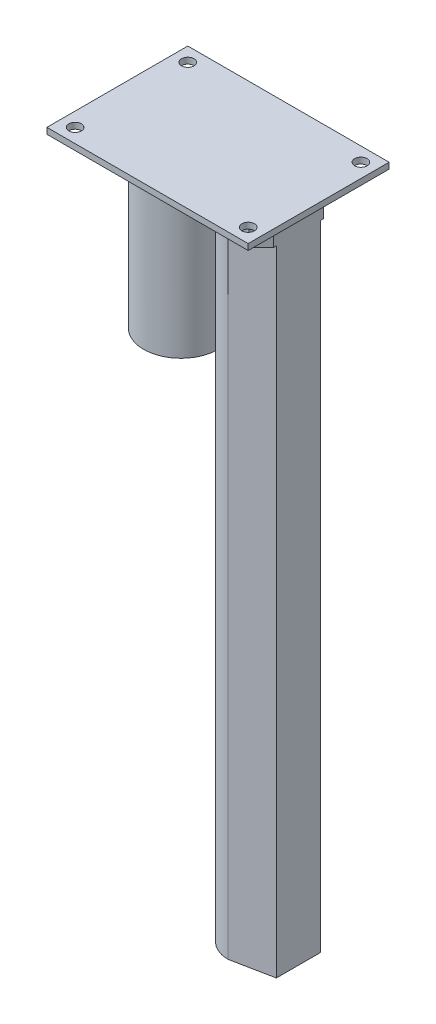
ISO-10303-21;
HEADER;
FILE_DESCRIPTION(('STEP AP214'),'2;1');
FILE_NAME('part.step','',(''),(''),'','','');
FILE_SCHEMA(('AUTOMOTIVE_DESIGN { 1 0 10303 214 1 1 1 1 }'));
ENDSEC;
DATA;
#1=APPLICATION_CONTEXT('core data for automotive mechanical design processes');
#2=APPLICATION_PROTOCOL_DEFINITION('international standard','automotive_design',2000,#1);
#3=PRODUCT_CONTEXT('',#1,'mechanical');
#4=PRODUCT('Part','Part','',(#3));
#5=PRODUCT_RELATED_PRODUCT_CATEGORY('part','',(#4));
#6=PRODUCT_DEFINITION_FORMATION('','',#4);
#7=PRODUCT_DEFINITION_CONTEXT('part definition',#1,'design');
#8=PRODUCT_DEFINITION('design','',#6,#7);
#9=PRODUCT_DEFINITION_SHAPE('','',#8);
#10=(LENGTH_UNIT() NAMED_UNIT(*) SI_UNIT(.MILLI.,.METRE.));
#11=(NAMED_UNIT(*) PLANE_ANGLE_UNIT() SI_UNIT($,.RADIAN.));
#12=(NAMED_UNIT(*) SI_UNIT($,.STERADIAN.) SOLID_ANGLE_UNIT());
#13=UNCERTAINTY_MEASURE_WITH_UNIT(LENGTH_MEASURE(1.E-05),#10,'distance_accuracy_value','');
#14=(GEOMETRIC_REPRESENTATION_CONTEXT(3) GLOBAL_UNCERTAINTY_ASSIGNED_CONTEXT((#13)) GLOBAL_UNIT_ASSIGNED_CONTEXT((#10,
#11,#12)) REPRESENTATION_CONTEXT('',''));
#15=CARTESIAN_POINT('',(0.,0.,0.));
#16=DIRECTION('',(0.,0.,1.));
#17=DIRECTION('',(1.,0.,0.));
#18=AXIS2_PLACEMENT_3D('',#15,#16,#17);
#19=CARTESIAN_POINT('',(-18.4,-15.,-15.5));
#20=DIRECTION('',(0.,0.,1.));
#21=DIRECTION('',(1.,0.,0.));
#22=AXIS2_PLACEMENT_3D('',#19,#20,#21);
#23=PLANE('',#22);
#24=DIRECTION('',(0.,1.,0.));
#25=VECTOR('',#24,1.);
#26=CARTESIAN_POINT('',(-18.4,-15.,-15.5));
#27=LINE('',#26,#25);
#28=CARTESIAN_POINT('',(-18.4,-12.,-15.5));
#29=VERTEX_POINT('',#28);
#30=CARTESIAN_POINT('',(-18.4,0.,-15.5));
#31=VERTEX_POINT('',#30);
#32=EDGE_CURVE('E41',#29,#31,#27,.T.);
#33=ORIENTED_EDGE('',*,*,#32,.F.);
#34=DIRECTION('',(1.,0.,0.));
#35=VECTOR('',#34,1.);
#36=CARTESIAN_POINT('',(-18.4,-12.,-15.5));
#37=LINE('',#36,#35);
#38=CARTESIAN_POINT('',(32.7573593128807,-12.,-15.5));
#39=VERTEX_POINT('',#38);
#40=EDGE_CURVE('E380',#29,#39,#37,.T.);
#41=ORIENTED_EDGE('',*,*,#40,.T.);
#42=DIRECTION('',(0.,1.,0.));
#43=VECTOR('',#42,1.);
#44=CARTESIAN_POINT('',(32.7573593128807,-15.,-15.5));
#45=LINE('',#44,#43);
#46=CARTESIAN_POINT('',(32.7573593128807,0.,-15.5));
#47=VERTEX_POINT('',#46);
#48=EDGE_CURVE('E118',#47,#39,#45,.F.);
#49=ORIENTED_EDGE('',*,*,#48,.F.);
#50=DIRECTION('',(1.,0.,0.));
#51=VECTOR('',#50,1.);
#52=CARTESIAN_POINT('',(0.,0.,-15.5));
#53=LINE('',#52,#51);
#54=EDGE_CURVE('E418',#31,#47,#53,.T.);
#55=ORIENTED_EDGE('',*,*,#54,.F.);
#56=EDGE_LOOP('',(#33,#41,#49,#55));
#57=FACE_BOUND('',#56,.T.);
#58=ADVANCED_FACE('F37',(#57),#23,.T.);
#59=CARTESIAN_POINT('',(37.8786796564404,-15.,-10.3786796564403));
#60=DIRECTION('',(-0.707106781186547,0.,0.707106781186548));
#61=DIRECTION('',(0.,1.,0.));
#62=AXIS2_PLACEMENT_3D('',#59,#60,#61);
#63=PLANE('',#62);
#64=DIRECTION('',(0.707106781186548,0.,0.707106781186547));
#65=VECTOR('',#64,1.);
#66=CARTESIAN_POINT('',(24.1286796564403,0.,-24.1286796564404));
#67=LINE('',#66,#65);
#68=CARTESIAN_POINT('',(37.,0.,-11.2573593128807));
#69=VERTEX_POINT('',#68);
#70=EDGE_CURVE('E374',#69,#47,#67,.F.);
#71=ORIENTED_EDGE('',*,*,#70,.T.);
#72=ORIENTED_EDGE('',*,*,#48,.T.);
#73=DIRECTION('',(-0.707106781186548,0.,-0.707106781186547));
#74=VECTOR('',#73,1.);
#75=CARTESIAN_POINT('',(14.9286796564403,-12.,-33.3286796564404));
#76=LINE('',#75,#74);
#77=CARTESIAN_POINT('',(37.,-12.,-11.2573593128807));
#78=VERTEX_POINT('',#77);
#79=EDGE_CURVE('E378',#39,#78,#76,.F.);
#80=ORIENTED_EDGE('',*,*,#79,.T.);
#81=DIRECTION('',(0.,-1.,0.));
#82=VECTOR('',#81,1.);
#83=CARTESIAN_POINT('',(37.,-15.,-11.2573593128807));
#84=LINE('',#83,#82);
#85=EDGE_CURVE('E415',#78,#69,#84,.F.);
#86=ORIENTED_EDGE('',*,*,#85,.T.);
#87=EDGE_LOOP('',(#71,#72,#80,#86));
#88=FACE_BOUND('',#87,.T.);
#89=ADVANCED_FACE('F436',(#88),#63,.T.);
#90=CARTESIAN_POINT('',(37.,-15.,18.5));
#91=DIRECTION('',(-1.,0.,0.));
#92=DIRECTION('',(0.,0.,1.));
#93=AXIS2_PLACEMENT_3D('',#90,#91,#92);
#94=PLANE('',#93);
#95=ORIENTED_EDGE('',*,*,#85,.F.);
#96=DIRECTION('',(0.,0.,1.));
#97=VECTOR('',#96,1.);
#98=CARTESIAN_POINT('',(37.,-12.,18.5));
#99=LINE('',#98,#97);
#100=CARTESIAN_POINT('',(37.,-12.,-8.54058829184433));
#101=VERTEX_POINT('',#100);
#102=EDGE_CURVE('E392',#78,#101,#99,.T.);
#103=ORIENTED_EDGE('',*,*,#102,.T.);
#104=DIRECTION('',(0.,1.,0.));
#105=VECTOR('',#104,1.);
#106=CARTESIAN_POINT('',(37.,-15.,-8.54058829184433));
#107=LINE('',#106,#105);
#108=CARTESIAN_POINT('',(37.,-327.,-8.54058829184433));
#109=VERTEX_POINT('',#108);
#110=EDGE_CURVE('E408',#109,#101,#107,.T.);
#111=ORIENTED_EDGE('',*,*,#110,.F.);
#112=DIRECTION('',(0.,0.,1.));
#113=VECTOR('',#112,1.);
#114=CARTESIAN_POINT('',(37.,-327.,18.5));
#115=LINE('',#114,#113);
#116=CARTESIAN_POINT('',(37.,-327.,8.54058829184432));
#117=VERTEX_POINT('',#116);
#118=EDGE_CURVE('E11',#109,#117,#115,.T.);
#119=ORIENTED_EDGE('',*,*,#118,.T.);
#120=DIRECTION('',(0.,1.,0.));
#121=VECTOR('',#120,1.);
#122=CARTESIAN_POINT('',(37.,-15.,8.54058829184433));
#123=LINE('',#122,#121);
#124=CARTESIAN_POINT('',(37.,-12.,8.54058829184432));
#125=VERTEX_POINT('',#124);
#126=EDGE_CURVE('E354',#117,#125,#123,.T.);
#127=ORIENTED_EDGE('',*,*,#126,.T.);
#128=DIRECTION('',(0.,0.,1.));
#129=VECTOR('',#128,1.);
#130=CARTESIAN_POINT('',(37.,-12.,18.5));
#131=LINE('',#130,#129);
#132=CARTESIAN_POINT('',(37.,-12.,11.2573593128807));
#133=VERTEX_POINT('',#132);
#134=EDGE_CURVE('E386',#125,#133,#131,.T.);
#135=ORIENTED_EDGE('',*,*,#134,.T.);
#136=DIRECTION('',(0.,1.,0.));
#137=VECTOR('',#136,1.);
#138=CARTESIAN_POINT('',(37.,-15.,11.2573593128807));
#139=LINE('',#138,#137);
#140=CARTESIAN_POINT('',(37.,0.,11.2573593128807));
#141=VERTEX_POINT('',#140);
#142=EDGE_CURVE('E113',#141,#133,#139,.F.);
#143=ORIENTED_EDGE('',*,*,#142,.F.);
#144=DIRECTION('',(0.,0.,1.));
#145=VECTOR('',#144,1.);
#146=CARTESIAN_POINT('',(37.,0.,0.));
#147=LINE('',#146,#145);
#148=EDGE_CURVE('E412',#69,#141,#147,.T.);
#149=ORIENTED_EDGE('',*,*,#148,.F.);
#150=EDGE_LOOP('',(#95,#103,#111,#119,#127,#135,#143,#149));
#151=FACE_BOUND('',#150,.T.);
#152=ADVANCED_FACE('F437',(#151),#94,.T.);
#153=CARTESIAN_POINT('',(31.8786796564403,-15.,16.3786796564404));
#154=DIRECTION('',(-0.707106781186549,0.,-0.707106781186546));
#155=DIRECTION('',(0.,1.,0.));
#156=AXIS2_PLACEMENT_3D('',#153,#154,#155);
#157=PLANE('',#156);
#158=DIRECTION('',(-0.707106781186546,0.,0.707106781186549));
#159=VECTOR('',#158,1.);
#160=CARTESIAN_POINT('',(24.1286796564404,0.,24.1286796564403));
#161=LINE('',#160,#159);
#162=CARTESIAN_POINT('',(32.7573593128807,0.,15.5));
#163=VERTEX_POINT('',#162);
#164=EDGE_CURVE('E376',#163,#141,#161,.F.);
#165=ORIENTED_EDGE('',*,*,#164,.T.);
#166=ORIENTED_EDGE('',*,*,#142,.T.);
#167=DIRECTION('',(0.707106781186546,0.,-0.707106781186549));
#168=VECTOR('',#167,1.);
#169=CARTESIAN_POINT('',(14.9286796564405,-12.,33.3286796564403));
#170=LINE('',#169,#168);
#171=CARTESIAN_POINT('',(32.7573593128807,-12.,15.5));
#172=VERTEX_POINT('',#171);
#173=EDGE_CURVE('E384',#133,#172,#170,.F.);
#174=ORIENTED_EDGE('',*,*,#173,.T.);
#175=DIRECTION('',(0.,-1.,0.));
#176=VECTOR('',#175,1.);
#177=CARTESIAN_POINT('',(32.7573593128807,-15.,15.5));
#178=LINE('',#177,#176);
#179=EDGE_CURVE('E405',#172,#163,#178,.F.);
#180=ORIENTED_EDGE('',*,*,#179,.T.);
#181=EDGE_LOOP('',(#165,#166,#174,#180));
#182=FACE_BOUND('',#181,.T.);
#183=ADVANCED_FACE('F463',(#182),#157,.T.);
#184=CARTESIAN_POINT('',(-18.4,-15.,15.5));
#185=DIRECTION('',(0.,0.,-1.));
#186=DIRECTION('',(-1.,0.,0.));
#187=AXIS2_PLACEMENT_3D('',#184,#185,#186);
#188=PLANE('',#187);
#189=ORIENTED_EDGE('',*,*,#179,.F.);
#190=DIRECTION('',(-1.,0.,0.));
#191=VECTOR('',#190,1.);
#192=CARTESIAN_POINT('',(-18.4,-12.,15.5));
#193=LINE('',#192,#191);
#194=CARTESIAN_POINT('',(-18.4,-12.,15.5));
#195=VERTEX_POINT('',#194);
#196=EDGE_CURVE('E382',#172,#195,#193,.T.);
#197=ORIENTED_EDGE('',*,*,#196,.T.);
#198=DIRECTION('',(0.,1.,0.));
#199=VECTOR('',#198,1.);
#200=CARTESIAN_POINT('',(-18.4,-15.,15.5));
#201=LINE('',#200,#199);
#202=CARTESIAN_POINT('',(-18.4,0.,15.5));
#203=VERTEX_POINT('',#202);
#204=EDGE_CURVE('E400',#195,#203,#201,.T.);
#205=ORIENTED_EDGE('',*,*,#204,.T.);
#206=DIRECTION('',(-1.,0.,0.));
#207=VECTOR('',#206,1.);
#208=CARTESIAN_POINT('',(0.,0.,15.5));
#209=LINE('',#208,#207);
#210=EDGE_CURVE('E403',#163,#203,#209,.T.);
#211=ORIENTED_EDGE('',*,*,#210,.F.);
#212=EDGE_LOOP('',(#189,#197,#205,#211));
#213=FACE_BOUND('',#212,.T.);
#214=ADVANCED_FACE('F466',(#213),#188,.T.);
#215=CARTESIAN_POINT('',(-18.4,-15.,0.));
#216=DIRECTION('',(0.,1.,0.));
#217=DIRECTION('',(0.,0.,1.));
#218=AXIS2_PLACEMENT_3D('',#215,#216,#217);
#219=CYLINDRICAL_SURFACE('',#218,15.5);
#220=CARTESIAN_POINT('',(-18.4,-82.,0.));
#221=DIRECTION('',(0.,-1.,0.));
#222=DIRECTION('',(0.,0.,-1.));
#223=AXIS2_PLACEMENT_3D('',#220,#221,#222);
#224=CIRCLE('',#223,15.5);
#225=CARTESIAN_POINT('',(-18.4,-82.,-15.5));
#226=VERTEX_POINT('',#225);
#227=EDGE_CURVE('E371',#226,#226,#224,.T.);
#228=ORIENTED_EDGE('',*,*,#227,.T.);
#229=EDGE_LOOP('',(#228));
#230=FACE_BOUND('',#229,.T.);
#231=ORIENTED_EDGE('',*,*,#204,.F.);
#232=CARTESIAN_POINT('',(-18.4,-12.,0.));
#233=DIRECTION('',(0.,-1.,0.));
#234=DIRECTION('',(0.,0.,-1.));
#235=AXIS2_PLACEMENT_3D('',#232,#233,#234);
#236=CIRCLE('',#235,15.5);
#237=EDGE_CURVE('E394',#29,#195,#236,.T.);
#238=ORIENTED_EDGE('',*,*,#237,.F.);
#239=ORIENTED_EDGE('',*,*,#32,.T.);
#240=CARTESIAN_POINT('',(-18.4,0.,0.));
#241=DIRECTION('',(0.,1.,0.));
#242=DIRECTION('',(0.,0.,1.));
#243=AXIS2_PLACEMENT_3D('',#240,#241,#242);
#244=CIRCLE('',#243,15.5);
#245=EDGE_CURVE('E397',#203,#31,#244,.F.);
#246=ORIENTED_EDGE('',*,*,#245,.F.);
#247=EDGE_LOOP('',(#231,#238,#239,#246));
#248=FACE_BOUND('',#247,.T.);
#249=ADVANCED_FACE('F427',(#230,#248),#219,.F.);
#250=CARTESIAN_POINT('',(-18.4,-12.,0.));
#251=DIRECTION('',(0.,-1.,0.));
#252=DIRECTION('',(0.,0.,-1.));
#253=AXIS2_PLACEMENT_3D('',#250,#251,#252);
#254=PLANE('',#253);
#255=ORIENTED_EDGE('',*,*,#102,.F.);
#256=ORIENTED_EDGE('',*,*,#79,.F.);
#257=ORIENTED_EDGE('',*,*,#40,.F.);
#258=ORIENTED_EDGE('',*,*,#237,.T.);
#259=ORIENTED_EDGE('',*,*,#196,.F.);
#260=ORIENTED_EDGE('',*,*,#173,.F.);
#261=ORIENTED_EDGE('',*,*,#134,.F.);
#262=DIRECTION('',(0.98058067569092,0.,-0.196116135138184));
#263=VECTOR('',#262,1.);
#264=CARTESIAN_POINT('',(3.06549774843161,-12.,15.327488742158));
#265=LINE('',#264,#263);
#266=CARTESIAN_POINT('',(19.7193526485845,-12.,11.9967177621274));
#267=VERTEX_POINT('',#266);
#268=EDGE_CURVE('E388',#267,#125,#265,.T.);
#269=ORIENTED_EDGE('',*,*,#268,.F.);
#270=CARTESIAN_POINT('',(20.,-12.,0.));
#271=DIRECTION('',(0.,-1.,0.));
#272=DIRECTION('',(0.,0.,-1.));
#273=AXIS2_PLACEMENT_3D('',#270,#271,#272);
#274=CIRCLE('',#273,12.);
#275=CARTESIAN_POINT('',(19.7193526485846,-12.,-11.9967177621274));
#276=VERTEX_POINT('',#275);
#277=EDGE_CURVE('E390',#276,#267,#274,.F.);
#278=ORIENTED_EDGE('',*,*,#277,.F.);
#279=DIRECTION('',(0.98058067569092,0.,0.196116135138184));
#280=VECTOR('',#279,1.);
#281=CARTESIAN_POINT('',(3.06549774843161,-12.,-15.327488742158));
#282=LINE('',#281,#280);
#283=EDGE_CURVE('E362',#276,#101,#282,.T.);
#284=ORIENTED_EDGE('',*,*,#283,.T.);
#285=EDGE_LOOP('',(#255,#256,#257,#258,#259,#260,#261,#269,#278,#284));
#286=FACE_BOUND('',#285,.T.);
#287=ADVANCED_FACE('F433',(#286),#254,.F.);
#288=CARTESIAN_POINT('',(0.,0.,0.));
#289=DIRECTION('',(0.,1.,0.));
#290=DIRECTION('',(0.,0.,1.));
#291=AXIS2_PLACEMENT_3D('',#288,#289,#290);
#292=PLANE('',#291);
#293=ORIENTED_EDGE('',*,*,#54,.T.);
#294=ORIENTED_EDGE('',*,*,#70,.F.);
#295=ORIENTED_EDGE('',*,*,#148,.T.);
#296=ORIENTED_EDGE('',*,*,#164,.F.);
#297=ORIENTED_EDGE('',*,*,#210,.T.);
#298=ORIENTED_EDGE('',*,*,#245,.T.);
#299=EDGE_LOOP('',(#293,#294,#295,#296,#297,#298));
#300=FACE_BOUND('',#299,.T.);
#301=ADVANCED_FACE('F439',(#300),#292,.F.);
#302=CARTESIAN_POINT('',(-18.4,-82.,0.));
#303=DIRECTION('',(0.,-1.,0.));
#304=DIRECTION('',(0.,0.,-1.));
#305=AXIS2_PLACEMENT_3D('',#302,#303,#304);
#306=PLANE('',#305);
#307=ORIENTED_EDGE('',*,*,#227,.F.);
#308=EDGE_LOOP('',(#307));
#309=FACE_BOUND('',#308,.T.);
#310=ADVANCED_FACE('F441',(#309),#306,.F.);
#311=CARTESIAN_POINT('',(20.,-330.,0.));
#312=DIRECTION('',(0.,1.,0.));
#313=DIRECTION('',(0.,0.,1.));
#314=AXIS2_PLACEMENT_3D('',#311,#312,#313);
#315=CYLINDRICAL_SURFACE('',#314,12.);
#316=ORIENTED_EDGE('',*,*,#277,.T.);
#317=DIRECTION('',(0.,1.,0.));
#318=VECTOR('',#317,1.);
#319=CARTESIAN_POINT('',(19.7193526485845,-327.,11.9967177621274));
#320=LINE('',#319,#318);
#321=CARTESIAN_POINT('',(19.7193526485845,-327.,11.9967177621274));
#322=VERTEX_POINT('',#321);
#323=EDGE_CURVE('E365',#322,#267,#320,.T.);
#324=ORIENTED_EDGE('',*,*,#323,.F.);
#325=CARTESIAN_POINT('',(20.,-327.,0.));
#326=DIRECTION('',(0.,-1.,0.));
#327=DIRECTION('',(0.,0.,-1.));
#328=AXIS2_PLACEMENT_3D('',#325,#326,#327);
#329=CIRCLE('',#328,12.);
#330=CARTESIAN_POINT('',(19.7193526485846,-327.,-11.9967177621274));
#331=VERTEX_POINT('',#330);
#332=EDGE_CURVE('E368',#331,#322,#329,.F.);
#333=ORIENTED_EDGE('',*,*,#332,.F.);
#334=DIRECTION('',(0.,1.,0.));
#335=VECTOR('',#334,1.);
#336=CARTESIAN_POINT('',(19.7193526485846,-327.,-11.9967177621274));
#337=LINE('',#336,#335);
#338=EDGE_CURVE('E359',#331,#276,#337,.T.);
#339=ORIENTED_EDGE('',*,*,#338,.T.);
#340=EDGE_LOOP('',(#316,#324,#333,#339));
#341=FACE_BOUND('',#340,.T.);
#342=ADVANCED_FACE('F447',(#341),#315,.F.);
#343=CARTESIAN_POINT('',(3.06549774843161,-330.,-15.327488742158));
#344=DIRECTION('',(-0.196116135138184,0.,0.98058067569092));
#345=DIRECTION('',(0.98058067569092,0.,0.196116135138184));
#346=AXIS2_PLACEMENT_3D('',#343,#344,#345);
#347=PLANE('',#346);
#348=ORIENTED_EDGE('',*,*,#283,.F.);
#349=ORIENTED_EDGE('',*,*,#338,.F.);
#350=DIRECTION('',(0.98058067569092,0.,0.196116135138184));
#351=VECTOR('',#350,1.);
#352=CARTESIAN_POINT('',(3.06549774843161,-327.,-15.327488742158));
#353=LINE('',#352,#351);
#354=EDGE_CURVE('E47',#331,#109,#353,.T.);
#355=ORIENTED_EDGE('',*,*,#354,.T.);
#356=ORIENTED_EDGE('',*,*,#110,.T.);
#357=EDGE_LOOP('',(#348,#349,#355,#356));
#358=FACE_BOUND('',#357,.T.);
#359=ADVANCED_FACE('F503',(#358),#347,.T.);
#360=CARTESIAN_POINT('',(3.06549774843161,-330.,15.327488742158));
#361=DIRECTION('',(0.196116135138184,0.,0.98058067569092));
#362=DIRECTION('',(0.98058067569092,0.,-0.196116135138184));
#363=AXIS2_PLACEMENT_3D('',#360,#361,#362);
#364=PLANE('',#363);
#365=ORIENTED_EDGE('',*,*,#268,.T.);
#366=ORIENTED_EDGE('',*,*,#126,.F.);
#367=DIRECTION('',(0.98058067569092,0.,-0.196116135138184));
#368=VECTOR('',#367,1.);
#369=CARTESIAN_POINT('',(3.06549774843161,-327.,15.327488742158));
#370=LINE('',#369,#368);
#371=EDGE_CURVE('E356',#322,#117,#370,.T.);
#372=ORIENTED_EDGE('',*,*,#371,.F.);
#373=ORIENTED_EDGE('',*,*,#323,.T.);
#374=EDGE_LOOP('',(#365,#366,#372,#373));
#375=FACE_BOUND('',#374,.T.);
#376=ADVANCED_FACE('F513',(#375),#364,.F.);
#377=CARTESIAN_POINT('',(0.,-327.,0.));
#378=DIRECTION('',(0.,-1.,0.));
#379=DIRECTION('',(0.,0.,-1.));
#380=AXIS2_PLACEMENT_3D('',#377,#378,#379);
#381=PLANE('',#380);
#382=CARTESIAN_POINT('',(20.,-327.,0.));
#383=DIRECTION('',(0.,-1.,0.));
#384=DIRECTION('',(0.,0.,-1.));
#385=AXIS2_PLACEMENT_3D('',#382,#383,#384);
#386=CIRCLE('',#385,9.99999999999999);
#387=CARTESIAN_POINT('',(20.,-327.,-9.99999999999999));
#388=VERTEX_POINT('',#387);
#389=EDGE_CURVE('E237',#388,#388,#386,.F.);
#390=ORIENTED_EDGE('',*,*,#389,.F.);
#391=EDGE_LOOP('',(#390));
#392=FACE_BOUND('',#391,.T.);
#393=ORIENTED_EDGE('',*,*,#332,.T.);
#394=ORIENTED_EDGE('',*,*,#371,.T.);
#395=ORIENTED_EDGE('',*,*,#118,.F.);
#396=ORIENTED_EDGE('',*,*,#354,.F.);
#397=EDGE_LOOP('',(#393,#394,#395,#396));
#398=FACE_BOUND('',#397,.T.);
#399=ADVANCED_FACE('F39',(#392,#398),#381,.F.);
#400=CARTESIAN_POINT('',(20.,3.00099999999998,0.));
#401=DIRECTION('',(0.,-1.,0.));
#402=DIRECTION('',(0.,0.,-1.));
#403=AXIS2_PLACEMENT_3D('',#400,#401,#402);
#404=CYLINDRICAL_SURFACE('',#403,9.99999999999999);
#405=CARTESIAN_POINT('',(20.,-330.,0.));
#406=DIRECTION('',(0.,-1.,0.));
#407=DIRECTION('',(0.,0.,-1.));
#408=AXIS2_PLACEMENT_3D('',#405,#406,#407);
#409=CIRCLE('',#408,9.99999999999999);
#410=CARTESIAN_POINT('',(20.,-330.,-9.99999999999999));
#411=VERTEX_POINT('',#410);
#412=EDGE_CURVE('E852',#411,#411,#409,.T.);
#413=ORIENTED_EDGE('',*,*,#412,.T.);
#414=EDGE_LOOP('',(#413));
#415=FACE_BOUND('',#414,.T.);
#416=ORIENTED_EDGE('',*,*,#389,.T.);
#417=EDGE_LOOP('',(#416));
#418=FACE_BOUND('',#417,.T.);
#419=ADVANCED_FACE('F532',(#415,#418),#404,.F.);
#420=CARTESIAN_POINT('',(-18.4,-15.,0.));
#421=DIRECTION('',(0.,-1.,0.));
#422=DIRECTION('',(0.,0.,-1.));
#423=AXIS2_PLACEMENT_3D('',#420,#421,#422);
#424=PLANE('',#423);
#425=DIRECTION('',(0.,0.,1.));
#426=VECTOR('',#425,1.);
#427=CARTESIAN_POINT('',(40.,-15.,18.5));
#428=LINE('',#427,#426);
#429=CARTESIAN_POINT('',(40.,-15.,-12.5));
#430=VERTEX_POINT('',#429);
#431=CARTESIAN_POINT('',(40.,-15.,-11.));
#432=VERTEX_POINT('',#431);
#433=EDGE_CURVE('E261',#430,#432,#428,.T.);
#434=ORIENTED_EDGE('',*,*,#433,.T.);
#435=DIRECTION('',(0.98058067569092,0.,0.196116135138184));
#436=VECTOR('',#435,1.);
#437=CARTESIAN_POINT('',(3.65384615384616,-15.,-18.2692307692308));
#438=LINE('',#437,#436);
#439=CARTESIAN_POINT('',(20.,-15.,-15.));
#440=VERTEX_POINT('',#439);
#441=EDGE_CURVE('E126',#440,#432,#438,.T.);
#442=ORIENTED_EDGE('',*,*,#441,.F.);
#443=CARTESIAN_POINT('',(20.,-15.,0.));
#444=DIRECTION('',(0.,-1.,0.));
#445=DIRECTION('',(0.,0.,-1.));
#446=AXIS2_PLACEMENT_3D('',#443,#444,#445);
#447=CIRCLE('',#446,15.);
#448=CARTESIAN_POINT('',(20.,-15.,15.));
#449=VERTEX_POINT('',#448);
#450=EDGE_CURVE('E218',#440,#449,#447,.F.);
#451=ORIENTED_EDGE('',*,*,#450,.T.);
#452=DIRECTION('',(0.98058067569092,0.,-0.196116135138184));
#453=VECTOR('',#452,1.);
#454=CARTESIAN_POINT('',(3.65384615384616,-15.,18.2692307692308));
#455=LINE('',#454,#453);
#456=CARTESIAN_POINT('',(40.,-15.,11.));
#457=VERTEX_POINT('',#456);
#458=EDGE_CURVE('E132',#449,#457,#455,.T.);
#459=ORIENTED_EDGE('',*,*,#458,.T.);
#460=CARTESIAN_POINT('',(40.,-15.,12.5));
#461=VERTEX_POINT('',#460);
#462=EDGE_CURVE('E259',#457,#461,#428,.T.);
#463=ORIENTED_EDGE('',*,*,#462,.T.);
#464=DIRECTION('',(0.707106781186546,0.,-0.707106781186549));
#465=VECTOR('',#464,1.);
#466=CARTESIAN_POINT('',(17.0500000000001,-15.,35.4499999999999));
#467=LINE('',#466,#465);
#468=CARTESIAN_POINT('',(34.,-15.,18.5));
#469=VERTEX_POINT('',#468);
#470=EDGE_CURVE('E345',#461,#469,#467,.F.);
#471=ORIENTED_EDGE('',*,*,#470,.T.);
#472=DIRECTION('',(-1.,0.,0.));
#473=VECTOR('',#472,1.);
#474=CARTESIAN_POINT('',(-18.4,-15.,18.5));
#475=LINE('',#474,#473);
#476=CARTESIAN_POINT('',(-18.4,-15.,18.5));
#477=VERTEX_POINT('',#476);
#478=EDGE_CURVE('E263',#469,#477,#475,.T.);
#479=ORIENTED_EDGE('',*,*,#478,.T.);
#480=CARTESIAN_POINT('',(-18.4,-15.,0.));
#481=DIRECTION('',(0.,-1.,0.));
#482=DIRECTION('',(0.,0.,-1.));
#483=AXIS2_PLACEMENT_3D('',#480,#481,#482);
#484=CIRCLE('',#483,18.5);
#485=CARTESIAN_POINT('',(-18.4,-15.,-18.5));
#486=VERTEX_POINT('',#485);
#487=EDGE_CURVE('E220',#486,#477,#484,.T.);
#488=ORIENTED_EDGE('',*,*,#487,.F.);
#489=DIRECTION('',(1.,0.,0.));
#490=VECTOR('',#489,1.);
#491=CARTESIAN_POINT('',(-18.4,-15.,-18.5));
#492=LINE('',#491,#490);
#493=CARTESIAN_POINT('',(34.,-15.,-18.5));
#494=VERTEX_POINT('',#493);
#495=EDGE_CURVE('E256',#486,#494,#492,.T.);
#496=ORIENTED_EDGE('',*,*,#495,.T.);
#497=DIRECTION('',(-0.707106781186548,0.,-0.707106781186547));
#498=VECTOR('',#497,1.);
#499=CARTESIAN_POINT('',(17.0499999999999,-15.,-35.45));
#500=LINE('',#499,#498);
#501=EDGE_CURVE('E343',#494,#430,#500,.F.);
#502=ORIENTED_EDGE('',*,*,#501,.T.);
#503=EDGE_LOOP('',(#434,#442,#451,#459,#463,#471,#479,#488,#496,#502));
#504=FACE_BOUND('',#503,.T.);
#505=ADVANCED_FACE('F541',(#504),#424,.T.);
#506=CARTESIAN_POINT('',(0.,0.,0.));
#507=DIRECTION('',(0.,1.,0.));
#508=DIRECTION('',(0.,0.,1.));
#509=AXIS2_PLACEMENT_3D('',#506,#507,#508);
#510=PLANE('',#509);
#511=CARTESIAN_POINT('',(43.,0.,28.));
#512=DIRECTION('',(0.,1.,0.));
#513=DIRECTION('',(0.,0.,1.));
#514=AXIS2_PLACEMENT_3D('',#511,#512,#513);
#515=CIRCLE('',#514,3.09999999999999);
#516=CARTESIAN_POINT('',(43.,0.,31.1));
#517=VERTEX_POINT('',#516);
#518=EDGE_CURVE('E328',#517,#517,#515,.T.);
#519=ORIENTED_EDGE('',*,*,#518,.T.);
#520=EDGE_LOOP('',(#519));
#521=FACE_BOUND('',#520,.T.);
#522=CARTESIAN_POINT('',(43.,0.,-28.));
#523=DIRECTION('',(0.,1.,0.));
#524=DIRECTION('',(0.,0.,1.));
#525=AXIS2_PLACEMENT_3D('',#522,#523,#524);
#526=CIRCLE('',#525,3.09999999999999);
#527=CARTESIAN_POINT('',(43.,0.,-24.9));
#528=VERTEX_POINT('',#527);
#529=EDGE_CURVE('E322',#528,#528,#526,.T.);
#530=ORIENTED_EDGE('',*,*,#529,.T.);
#531=EDGE_LOOP('',(#530));
#532=FACE_BOUND('',#531,.T.);
#533=DIRECTION('',(0.,0.,-1.));
#534=VECTOR('',#533,1.);
#535=CARTESIAN_POINT('',(50.,0.,-35.));
#536=LINE('',#535,#534);
#537=CARTESIAN_POINT('',(50.,0.,35.));
#538=VERTEX_POINT('',#537);
#539=CARTESIAN_POINT('',(50.,0.,-35.));
#540=VERTEX_POINT('',#539);
#541=EDGE_CURVE('E290',#538,#540,#536,.T.);
#542=ORIENTED_EDGE('',*,*,#541,.F.);
#543=DIRECTION('',(1.,0.,0.));
#544=VECTOR('',#543,1.);
#545=CARTESIAN_POINT('',(-50.,0.,35.));
#546=LINE('',#545,#544);
#547=CARTESIAN_POINT('',(-50.,0.,35.));
#548=VERTEX_POINT('',#547);
#549=EDGE_CURVE('E297',#548,#538,#546,.T.);
#550=ORIENTED_EDGE('',*,*,#549,.F.);
#551=DIRECTION('',(0.,0.,1.));
#552=VECTOR('',#551,1.);
#553=CARTESIAN_POINT('',(-50.,0.,-35.));
#554=LINE('',#553,#552);
#555=CARTESIAN_POINT('',(-50.,0.,-35.));
#556=VERTEX_POINT('',#555);
#557=EDGE_CURVE('E308',#556,#548,#554,.T.);
#558=ORIENTED_EDGE('',*,*,#557,.F.);
#559=DIRECTION('',(-1.,0.,0.));
#560=VECTOR('',#559,1.);
#561=CARTESIAN_POINT('',(-50.,0.,-35.));
#562=LINE('',#561,#560);
#563=EDGE_CURVE('E306',#540,#556,#562,.T.);
#564=ORIENTED_EDGE('',*,*,#563,.F.);
#565=EDGE_LOOP('',(#542,#550,#558,#564));
#566=FACE_BOUND('',#565,.T.);
#567=CARTESIAN_POINT('',(-43.,0.,-28.));
#568=DIRECTION('',(0.,1.,0.));
#569=DIRECTION('',(0.,0.,1.));
#570=AXIS2_PLACEMENT_3D('',#567,#568,#569);
#571=CIRCLE('',#570,3.09999999999999);
#572=CARTESIAN_POINT('',(-43.,0.,-24.9));
#573=VERTEX_POINT('',#572);
#574=EDGE_CURVE('E287',#573,#573,#571,.T.);
#575=ORIENTED_EDGE('',*,*,#574,.T.);
#576=EDGE_LOOP('',(#575));
#577=FACE_BOUND('',#576,.T.);
#578=CARTESIAN_POINT('',(-43.,0.,28.));
#579=DIRECTION('',(0.,1.,0.));
#580=DIRECTION('',(0.,0.,1.));
#581=AXIS2_PLACEMENT_3D('',#578,#579,#580);
#582=CIRCLE('',#581,3.09999999999999);
#583=CARTESIAN_POINT('',(-43.,0.,31.1));
#584=VERTEX_POINT('',#583);
#585=EDGE_CURVE('E280',#584,#584,#582,.T.);
#586=ORIENTED_EDGE('',*,*,#585,.T.);
#587=EDGE_LOOP('',(#586));
#588=FACE_BOUND('',#587,.T.);
#589=CARTESIAN_POINT('',(-18.4,0.,0.));
#590=DIRECTION('',(0.,-1.,0.));
#591=DIRECTION('',(0.,0.,-1.));
#592=AXIS2_PLACEMENT_3D('',#589,#590,#591);
#593=CIRCLE('',#592,18.5);
#594=CARTESIAN_POINT('',(-18.4,0.,18.5));
#595=VERTEX_POINT('',#594);
#596=CARTESIAN_POINT('',(-18.4,0.,-18.5));
#597=VERTEX_POINT('',#596);
#598=EDGE_CURVE('E253',#595,#597,#593,.T.);
#599=ORIENTED_EDGE('',*,*,#598,.F.);
#600=DIRECTION('',(-1.,0.,0.));
#601=VECTOR('',#600,1.);
#602=CARTESIAN_POINT('',(-18.4,0.,18.5));
#603=LINE('',#602,#601);
#604=CARTESIAN_POINT('',(34.,0.,18.5));
#605=VERTEX_POINT('',#604);
#606=EDGE_CURVE('E260',#605,#595,#603,.T.);
#607=ORIENTED_EDGE('',*,*,#606,.F.);
#608=DIRECTION('',(-0.707106781186546,0.,0.707106781186549));
#609=VECTOR('',#608,1.);
#610=CARTESIAN_POINT('',(26.2500000000001,0.,26.2499999999999));
#611=LINE('',#610,#609);
#612=CARTESIAN_POINT('',(40.,0.,12.5));
#613=VERTEX_POINT('',#612);
#614=EDGE_CURVE('E349',#605,#613,#611,.F.);
#615=ORIENTED_EDGE('',*,*,#614,.T.);
#616=DIRECTION('',(0.,0.,1.));
#617=VECTOR('',#616,1.);
#618=CARTESIAN_POINT('',(40.,0.,18.5));
#619=LINE('',#618,#617);
#620=CARTESIAN_POINT('',(40.,0.,-12.5));
#621=VERTEX_POINT('',#620);
#622=EDGE_CURVE('E271',#621,#613,#619,.T.);
#623=ORIENTED_EDGE('',*,*,#622,.F.);
#624=DIRECTION('',(0.707106781186548,0.,0.707106781186547));
#625=VECTOR('',#624,1.);
#626=CARTESIAN_POINT('',(26.25,0.,-26.25));
#627=LINE('',#626,#625);
#628=CARTESIAN_POINT('',(34.,0.,-18.5));
#629=VERTEX_POINT('',#628);
#630=EDGE_CURVE('E351',#621,#629,#627,.F.);
#631=ORIENTED_EDGE('',*,*,#630,.T.);
#632=DIRECTION('',(1.,0.,0.));
#633=VECTOR('',#632,1.);
#634=CARTESIAN_POINT('',(-18.4,0.,-18.5));
#635=LINE('',#634,#633);
#636=EDGE_CURVE('E268',#597,#629,#635,.T.);
#637=ORIENTED_EDGE('',*,*,#636,.F.);
#638=EDGE_LOOP('',(#599,#607,#615,#623,#631,#637));
#639=FACE_BOUND('',#638,.T.);
#640=ADVANCED_FACE('F700',(#521,#532,#566,#577,#588,#639),#510,.F.);
#641=CARTESIAN_POINT('',(43.,0.,28.));
#642=DIRECTION('',(0.,1.,0.));
#643=DIRECTION('',(0.,0.,1.));
#644=AXIS2_PLACEMENT_3D('',#641,#642,#643);
#645=CYLINDRICAL_SURFACE('',#644,3.09999999999999);
#646=ORIENTED_EDGE('',*,*,#518,.F.);
#647=EDGE_LOOP('',(#646));
#648=FACE_BOUND('',#647,.T.);
#649=CARTESIAN_POINT('',(43.,3.,28.));
#650=DIRECTION('',(0.,1.,0.));
#651=DIRECTION('',(0.,0.,1.));
#652=AXIS2_PLACEMENT_3D('',#649,#650,#651);
#653=CIRCLE('',#652,3.09999999999999);
#654=CARTESIAN_POINT('',(43.,3.,31.1));
#655=VERTEX_POINT('',#654);
#656=EDGE_CURVE('E331',#655,#655,#653,.T.);
#657=ORIENTED_EDGE('',*,*,#656,.T.);
#658=EDGE_LOOP('',(#657));
#659=FACE_BOUND('',#658,.T.);
#660=ADVANCED_FACE('F693',(#648,#659),#645,.F.);
#661=CARTESIAN_POINT('',(43.,0.,-28.));
#662=DIRECTION('',(0.,1.,0.));
#663=DIRECTION('',(0.,0.,1.));
#664=AXIS2_PLACEMENT_3D('',#661,#662,#663);
#665=CYLINDRICAL_SURFACE('',#664,3.09999999999999);
#666=ORIENTED_EDGE('',*,*,#529,.F.);
#667=EDGE_LOOP('',(#666));
#668=FACE_BOUND('',#667,.T.);
#669=CARTESIAN_POINT('',(43.,3.,-28.));
#670=DIRECTION('',(0.,1.,0.));
#671=DIRECTION('',(0.,0.,1.));
#672=AXIS2_PLACEMENT_3D('',#669,#670,#671);
#673=CIRCLE('',#672,3.09999999999999);
#674=CARTESIAN_POINT('',(43.,3.,-24.9));
#675=VERTEX_POINT('',#674);
#676=EDGE_CURVE('E325',#675,#675,#673,.T.);
#677=ORIENTED_EDGE('',*,*,#676,.T.);
#678=EDGE_LOOP('',(#677));
#679=FACE_BOUND('',#678,.T.);
#680=ADVANCED_FACE('F686',(#668,#679),#665,.F.);
#681=CARTESIAN_POINT('',(50.,3.,-35.));
#682=DIRECTION('',(-1.,0.,0.));
#683=DIRECTION('',(0.,0.,1.));
#684=AXIS2_PLACEMENT_3D('',#681,#682,#683);
#685=PLANE('',#684);
#686=ORIENTED_EDGE('',*,*,#541,.T.);
#687=DIRECTION('',(0.,-1.,0.));
#688=VECTOR('',#687,1.);
#689=CARTESIAN_POINT('',(50.,3.,-35.));
#690=LINE('',#689,#688);
#691=CARTESIAN_POINT('',(50.,3.,-35.));
#692=VERTEX_POINT('',#691);
#693=EDGE_CURVE('E319',#692,#540,#690,.T.);
#694=ORIENTED_EDGE('',*,*,#693,.F.);
#695=DIRECTION('',(0.,0.,-1.));
#696=VECTOR('',#695,1.);
#697=CARTESIAN_POINT('',(50.,3.,-35.));
#698=LINE('',#697,#696);
#699=CARTESIAN_POINT('',(50.,3.,35.));
#700=VERTEX_POINT('',#699);
#701=EDGE_CURVE('E293',#700,#692,#698,.T.);
#702=ORIENTED_EDGE('',*,*,#701,.F.);
#703=DIRECTION('',(0.,-1.,0.));
#704=VECTOR('',#703,1.);
#705=CARTESIAN_POINT('',(50.,3.,35.));
#706=LINE('',#705,#704);
#707=EDGE_CURVE('E303',#700,#538,#706,.T.);
#708=ORIENTED_EDGE('',*,*,#707,.T.);
#709=EDGE_LOOP('',(#686,#694,#702,#708));
#710=FACE_BOUND('',#709,.T.);
#711=ADVANCED_FACE('F678',(#710),#685,.F.);
#712=CARTESIAN_POINT('',(-50.,3.,-35.));
#713=DIRECTION('',(0.,0.,1.));
#714=DIRECTION('',(1.,0.,0.));
#715=AXIS2_PLACEMENT_3D('',#712,#713,#714);
#716=PLANE('',#715);
#717=ORIENTED_EDGE('',*,*,#563,.T.);
#718=DIRECTION('',(0.,-1.,0.));
#719=VECTOR('',#718,1.);
#720=CARTESIAN_POINT('',(-50.,3.,-35.));
#721=LINE('',#720,#719);
#722=CARTESIAN_POINT('',(-50.,3.,-35.));
#723=VERTEX_POINT('',#722);
#724=EDGE_CURVE('E316',#723,#556,#721,.T.);
#725=ORIENTED_EDGE('',*,*,#724,.F.);
#726=DIRECTION('',(-1.,0.,0.));
#727=VECTOR('',#726,1.);
#728=CARTESIAN_POINT('',(-50.,3.,-35.));
#729=LINE('',#728,#727);
#730=EDGE_CURVE('E296',#692,#723,#729,.T.);
#731=ORIENTED_EDGE('',*,*,#730,.F.);
#732=ORIENTED_EDGE('',*,*,#693,.T.);
#733=EDGE_LOOP('',(#717,#725,#731,#732));
#734=FACE_BOUND('',#733,.T.);
#735=ADVANCED_FACE('F670',(#734),#716,.F.);
#736=CARTESIAN_POINT('',(-50.,3.,-35.));
#737=DIRECTION('',(1.,0.,0.));
#738=DIRECTION('',(0.,0.,-1.));
#739=AXIS2_PLACEMENT_3D('',#736,#737,#738);
#740=PLANE('',#739);
#741=ORIENTED_EDGE('',*,*,#557,.T.);
#742=DIRECTION('',(0.,-1.,0.));
#743=VECTOR('',#742,1.);
#744=CARTESIAN_POINT('',(-50.,3.,35.));
#745=LINE('',#744,#743);
#746=CARTESIAN_POINT('',(-50.,3.,35.));
#747=VERTEX_POINT('',#746);
#748=EDGE_CURVE('E313',#747,#548,#745,.T.);
#749=ORIENTED_EDGE('',*,*,#748,.F.);
#750=DIRECTION('',(0.,0.,1.));
#751=VECTOR('',#750,1.);
#752=CARTESIAN_POINT('',(-50.,3.,-35.));
#753=LINE('',#752,#751);
#754=EDGE_CURVE('E299',#723,#747,#753,.T.);
#755=ORIENTED_EDGE('',*,*,#754,.F.);
#756=ORIENTED_EDGE('',*,*,#724,.T.);
#757=EDGE_LOOP('',(#741,#749,#755,#756));
#758=FACE_BOUND('',#757,.T.);
#759=ADVANCED_FACE('F662',(#758),#740,.F.);
#760=CARTESIAN_POINT('',(-50.,3.,35.));
#761=DIRECTION('',(0.,0.,-1.));
#762=DIRECTION('',(-1.,0.,0.));
#763=AXIS2_PLACEMENT_3D('',#760,#761,#762);
#764=PLANE('',#763);
#765=ORIENTED_EDGE('',*,*,#549,.T.);
#766=ORIENTED_EDGE('',*,*,#707,.F.);
#767=DIRECTION('',(1.,0.,0.));
#768=VECTOR('',#767,1.);
#769=CARTESIAN_POINT('',(-50.,3.,35.));
#770=LINE('',#769,#768);
#771=EDGE_CURVE('E301',#747,#700,#770,.T.);
#772=ORIENTED_EDGE('',*,*,#771,.F.);
#773=ORIENTED_EDGE('',*,*,#748,.T.);
#774=EDGE_LOOP('',(#765,#766,#772,#773));
#775=FACE_BOUND('',#774,.T.);
#776=ADVANCED_FACE('F654',(#775),#764,.F.);
#777=CARTESIAN_POINT('',(0.,3.,0.));
#778=DIRECTION('',(0.,1.,0.));
#779=DIRECTION('',(0.,0.,1.));
#780=AXIS2_PLACEMENT_3D('',#777,#778,#779);
#781=PLANE('',#780);
#782=CARTESIAN_POINT('',(-43.,3.,28.));
#783=DIRECTION('',(0.,1.,0.));
#784=DIRECTION('',(0.,0.,1.));
#785=AXIS2_PLACEMENT_3D('',#782,#783,#784);
#786=CIRCLE('',#785,3.09999999999999);
#787=CARTESIAN_POINT('',(-43.,3.,31.1));
#788=VERTEX_POINT('',#787);
#789=EDGE_CURVE('E283',#788,#788,#786,.T.);
#790=ORIENTED_EDGE('',*,*,#789,.F.);
#791=EDGE_LOOP('',(#790));
#792=FACE_BOUND('',#791,.T.);
#793=CARTESIAN_POINT('',(-43.,3.,-28.));
#794=DIRECTION('',(0.,1.,0.));
#795=DIRECTION('',(0.,0.,1.));
#796=AXIS2_PLACEMENT_3D('',#793,#794,#795);
#797=CIRCLE('',#796,3.09999999999999);
#798=CARTESIAN_POINT('',(-43.,3.,-24.9));
#799=VERTEX_POINT('',#798);
#800=EDGE_CURVE('E286',#799,#799,#797,.T.);
#801=ORIENTED_EDGE('',*,*,#800,.F.);
#802=EDGE_LOOP('',(#801));
#803=FACE_BOUND('',#802,.T.);
#804=ORIENTED_EDGE('',*,*,#701,.T.);
#805=ORIENTED_EDGE('',*,*,#730,.T.);
#806=ORIENTED_EDGE('',*,*,#754,.T.);
#807=ORIENTED_EDGE('',*,*,#771,.T.);
#808=EDGE_LOOP('',(#804,#805,#806,#807));
#809=FACE_BOUND('',#808,.T.);
#810=ORIENTED_EDGE('',*,*,#676,.F.);
#811=EDGE_LOOP('',(#810));
#812=FACE_BOUND('',#811,.T.);
#813=ORIENTED_EDGE('',*,*,#656,.F.);
#814=EDGE_LOOP('',(#813));
#815=FACE_BOUND('',#814,.T.);
#816=ADVANCED_FACE('F645',(#792,#803,#809,#812,#815),#781,.T.);
#817=CARTESIAN_POINT('',(-43.,0.,-28.));
#818=DIRECTION('',(0.,1.,0.));
#819=DIRECTION('',(0.,0.,1.));
#820=AXIS2_PLACEMENT_3D('',#817,#818,#819);
#821=CYLINDRICAL_SURFACE('',#820,3.09999999999999);
#822=ORIENTED_EDGE('',*,*,#574,.F.);
#823=EDGE_LOOP('',(#822));
#824=FACE_BOUND('',#823,.T.);
#825=ORIENTED_EDGE('',*,*,#800,.T.);
#826=EDGE_LOOP('',(#825));
#827=FACE_BOUND('',#826,.T.);
#828=ADVANCED_FACE('F636',(#824,#827),#821,.F.);
#829=CARTESIAN_POINT('',(-43.,0.,28.));
#830=DIRECTION('',(0.,1.,0.));
#831=DIRECTION('',(0.,0.,1.));
#832=AXIS2_PLACEMENT_3D('',#829,#830,#831);
#833=CYLINDRICAL_SURFACE('',#832,3.09999999999999);
#834=ORIENTED_EDGE('',*,*,#585,.F.);
#835=EDGE_LOOP('',(#834));
#836=FACE_BOUND('',#835,.T.);
#837=ORIENTED_EDGE('',*,*,#789,.T.);
#838=EDGE_LOOP('',(#837));
#839=FACE_BOUND('',#838,.T.);
#840=ADVANCED_FACE('F628',(#836,#839),#833,.F.);
#841=CARTESIAN_POINT('',(-18.4,-15.,0.));
#842=DIRECTION('',(0.,1.,0.));
#843=DIRECTION('',(0.,0.,1.));
#844=AXIS2_PLACEMENT_3D('',#841,#842,#843);
#845=CYLINDRICAL_SURFACE('',#844,18.5);
#846=ORIENTED_EDGE('',*,*,#598,.T.);
#847=DIRECTION('',(0.,1.,0.));
#848=VECTOR('',#847,1.);
#849=CARTESIAN_POINT('',(-18.4,-15.,-18.5));
#850=LINE('',#849,#848);
#851=EDGE_CURVE('E277',#486,#597,#850,.T.);
#852=ORIENTED_EDGE('',*,*,#851,.F.);
#853=ORIENTED_EDGE('',*,*,#487,.T.);
#854=DIRECTION('',(0.,1.,0.));
#855=VECTOR('',#854,1.);
#856=CARTESIAN_POINT('',(-18.4,-15.,18.5));
#857=LINE('',#856,#855);
#858=EDGE_CURVE('E265',#477,#595,#857,.T.);
#859=ORIENTED_EDGE('',*,*,#858,.T.);
#860=EDGE_LOOP('',(#846,#852,#853,#859));
#861=FACE_BOUND('',#860,.T.);
#862=CARTESIAN_POINT('',(-18.4,-85.,0.));
#863=DIRECTION('',(0.,-1.,0.));
#864=DIRECTION('',(0.,0.,-1.));
#865=AXIS2_PLACEMENT_3D('',#862,#863,#864);
#866=CIRCLE('',#865,18.5);
#867=CARTESIAN_POINT('',(-18.4,-85.,-18.5));
#868=VERTEX_POINT('',#867);
#869=EDGE_CURVE('E250',#868,#868,#866,.T.);
#870=ORIENTED_EDGE('',*,*,#869,.F.);
#871=EDGE_LOOP('',(#870));
#872=FACE_BOUND('',#871,.T.);
#873=ADVANCED_FACE('F620',(#861,#872),#845,.T.);
#874=CARTESIAN_POINT('',(-18.4,-15.,-18.5));
#875=DIRECTION('',(0.,0.,1.));
#876=DIRECTION('',(1.,0.,0.));
#877=AXIS2_PLACEMENT_3D('',#874,#875,#876);
#878=PLANE('',#877);
#879=ORIENTED_EDGE('',*,*,#636,.T.);
#880=DIRECTION('',(0.,-1.,0.));
#881=VECTOR('',#880,1.);
#882=CARTESIAN_POINT('',(34.,-15.,-18.5));
#883=LINE('',#882,#881);
#884=EDGE_CURVE('E347',#629,#494,#883,.T.);
#885=ORIENTED_EDGE('',*,*,#884,.T.);
#886=ORIENTED_EDGE('',*,*,#495,.F.);
#887=ORIENTED_EDGE('',*,*,#851,.T.);
#888=EDGE_LOOP('',(#879,#885,#886,#887));
#889=FACE_BOUND('',#888,.T.);
#890=ADVANCED_FACE('F613',(#889),#878,.F.);
#891=CARTESIAN_POINT('',(40.,-15.,18.5));
#892=DIRECTION('',(-1.,0.,0.));
#893=DIRECTION('',(0.,0.,1.));
#894=AXIS2_PLACEMENT_3D('',#891,#892,#893);
#895=PLANE('',#894);
#896=ORIENTED_EDGE('',*,*,#622,.T.);
#897=DIRECTION('',(0.,-1.,0.));
#898=VECTOR('',#897,1.);
#899=CARTESIAN_POINT('',(40.,-15.,12.5));
#900=LINE('',#899,#898);
#901=EDGE_CURVE('E340',#613,#461,#900,.T.);
#902=ORIENTED_EDGE('',*,*,#901,.T.);
#903=ORIENTED_EDGE('',*,*,#462,.F.);
#904=DIRECTION('',(0.,1.,0.));
#905=VECTOR('',#904,1.);
#906=CARTESIAN_POINT('',(40.,-330.,11.));
#907=LINE('',#906,#905);
#908=CARTESIAN_POINT('',(40.,-330.,11.));
#909=VERTEX_POINT('',#908);
#910=EDGE_CURVE('E246',#909,#457,#907,.T.);
#911=ORIENTED_EDGE('',*,*,#910,.F.);
#912=DIRECTION('',(0.,0.,1.));
#913=VECTOR('',#912,1.);
#914=CARTESIAN_POINT('',(40.,-330.,0.));
#915=LINE('',#914,#913);
#916=CARTESIAN_POINT('',(40.,-330.,-11.));
#917=VERTEX_POINT('',#916);
#918=EDGE_CURVE('E229',#917,#909,#915,.T.);
#919=ORIENTED_EDGE('',*,*,#918,.F.);
#920=DIRECTION('',(0.,1.,0.));
#921=VECTOR('',#920,1.);
#922=CARTESIAN_POINT('',(40.,-330.,-11.));
#923=LINE('',#922,#921);
#924=EDGE_CURVE('E221',#917,#432,#923,.T.);
#925=ORIENTED_EDGE('',*,*,#924,.T.);
#926=ORIENTED_EDGE('',*,*,#433,.F.);
#927=DIRECTION('',(0.,1.,0.));
#928=VECTOR('',#927,1.);
#929=CARTESIAN_POINT('',(40.,-15.,-12.5));
#930=LINE('',#929,#928);
#931=EDGE_CURVE('E337',#430,#621,#930,.T.);
#932=ORIENTED_EDGE('',*,*,#931,.T.);
#933=EDGE_LOOP('',(#896,#902,#903,#911,#919,#925,#926,#932));
#934=FACE_BOUND('',#933,.T.);
#935=ADVANCED_FACE('F606',(#934),#895,.F.);
#936=CARTESIAN_POINT('',(-18.4,-15.,18.5));
#937=DIRECTION('',(0.,0.,-1.));
#938=DIRECTION('',(-1.,0.,0.));
#939=AXIS2_PLACEMENT_3D('',#936,#937,#938);
#940=PLANE('',#939);
#941=ORIENTED_EDGE('',*,*,#478,.F.);
#942=DIRECTION('',(0.,1.,0.));
#943=VECTOR('',#942,1.);
#944=CARTESIAN_POINT('',(34.,-15.,18.5));
#945=LINE('',#944,#943);
#946=EDGE_CURVE('E334',#469,#605,#945,.T.);
#947=ORIENTED_EDGE('',*,*,#946,.T.);
#948=ORIENTED_EDGE('',*,*,#606,.T.);
#949=ORIENTED_EDGE('',*,*,#858,.F.);
#950=EDGE_LOOP('',(#941,#947,#948,#949));
#951=FACE_BOUND('',#950,.T.);
#952=ADVANCED_FACE('F599',(#951),#940,.F.);
#953=CARTESIAN_POINT('',(34.,-15.,18.5));
#954=DIRECTION('',(-0.707106781186549,0.,-0.707106781186546));
#955=DIRECTION('',(0.,1.,0.));
#956=AXIS2_PLACEMENT_3D('',#953,#954,#955);
#957=PLANE('',#956);
#958=ORIENTED_EDGE('',*,*,#470,.F.);
#959=ORIENTED_EDGE('',*,*,#901,.F.);
#960=ORIENTED_EDGE('',*,*,#614,.F.);
#961=ORIENTED_EDGE('',*,*,#946,.F.);
#962=EDGE_LOOP('',(#958,#959,#960,#961));
#963=FACE_BOUND('',#962,.T.);
#964=ADVANCED_FACE('F591',(#963),#957,.F.);
#965=CARTESIAN_POINT('',(40.,-15.,-12.5));
#966=DIRECTION('',(-0.707106781186547,0.,0.707106781186548));
#967=DIRECTION('',(0.,1.,0.));
#968=AXIS2_PLACEMENT_3D('',#965,#966,#967);
#969=PLANE('',#968);
#970=ORIENTED_EDGE('',*,*,#501,.F.);
#971=ORIENTED_EDGE('',*,*,#884,.F.);
#972=ORIENTED_EDGE('',*,*,#630,.F.);
#973=ORIENTED_EDGE('',*,*,#931,.F.);
#974=EDGE_LOOP('',(#970,#971,#972,#973));
#975=FACE_BOUND('',#974,.T.);
#976=ADVANCED_FACE('F458',(#975),#969,.F.);
#977=CARTESIAN_POINT('',(-18.4,-85.,0.));
#978=DIRECTION('',(0.,-1.,0.));
#979=DIRECTION('',(0.,0.,-1.));
#980=AXIS2_PLACEMENT_3D('',#977,#978,#979);
#981=PLANE('',#980);
#982=ORIENTED_EDGE('',*,*,#869,.T.);
#983=EDGE_LOOP('',(#982));
#984=FACE_BOUND('',#983,.T.);
#985=ADVANCED_FACE('F574',(#984),#981,.T.);
#986=CARTESIAN_POINT('',(20.,-330.,0.));
#987=DIRECTION('',(0.,1.,0.));
#988=DIRECTION('',(0.,0.,1.));
#989=AXIS2_PLACEMENT_3D('',#986,#987,#988);
#990=CYLINDRICAL_SURFACE('',#989,15.);
#991=ORIENTED_EDGE('',*,*,#450,.F.);
#992=DIRECTION('',(0.,1.,0.));
#993=VECTOR('',#992,1.);
#994=CARTESIAN_POINT('',(20.,-330.,-15.));
#995=LINE('',#994,#993);
#996=CARTESIAN_POINT('',(20.,-330.,-15.));
#997=VERTEX_POINT('',#996);
#998=EDGE_CURVE('E211',#997,#440,#995,.T.);
#999=ORIENTED_EDGE('',*,*,#998,.F.);
#1000=CARTESIAN_POINT('',(20.,-330.,0.));
#1001=DIRECTION('',(0.,-1.,0.));
#1002=DIRECTION('',(0.,0.,-1.));
#1003=AXIS2_PLACEMENT_3D('',#1000,#1001,#1002);
#1004=CIRCLE('',#1003,15.);
#1005=CARTESIAN_POINT('',(20.,-330.,15.));
#1006=VERTEX_POINT('',#1005);
#1007=EDGE_CURVE('E216',#997,#1006,#1004,.F.);
#1008=ORIENTED_EDGE('',*,*,#1007,.T.);
#1009=DIRECTION('',(0.,1.,0.));
#1010=VECTOR('',#1009,1.);
#1011=CARTESIAN_POINT('',(20.,-330.,15.));
#1012=LINE('',#1011,#1010);
#1013=EDGE_CURVE('E242',#1006,#449,#1012,.T.);
#1014=ORIENTED_EDGE('',*,*,#1013,.T.);
#1015=EDGE_LOOP('',(#991,#999,#1008,#1014));
#1016=FACE_BOUND('',#1015,.T.);
#1017=ADVANCED_FACE('F213',(#1016),#990,.T.);
#1018=CARTESIAN_POINT('',(3.65384615384616,-330.,-18.2692307692308));
#1019=DIRECTION('',(-0.196116135138184,0.,0.98058067569092));
#1020=DIRECTION('',(0.98058067569092,0.,0.196116135138184));
#1021=AXIS2_PLACEMENT_3D('',#1018,#1019,#1020);
#1022=PLANE('',#1021);
#1023=ORIENTED_EDGE('',*,*,#441,.T.);
#1024=ORIENTED_EDGE('',*,*,#924,.F.);
#1025=DIRECTION('',(0.98058067569092,0.,0.196116135138184));
#1026=VECTOR('',#1025,1.);
#1027=CARTESIAN_POINT('',(3.65384615384616,-330.,-18.2692307692308));
#1028=LINE('',#1027,#1026);
#1029=EDGE_CURVE('E224',#997,#917,#1028,.T.);
#1030=ORIENTED_EDGE('',*,*,#1029,.F.);
#1031=ORIENTED_EDGE('',*,*,#998,.T.);
#1032=EDGE_LOOP('',(#1023,#1024,#1030,#1031));
#1033=FACE_BOUND('',#1032,.T.);
#1034=ADVANCED_FACE('F225',(#1033),#1022,.F.);
#1035=CARTESIAN_POINT('',(3.65384615384616,-330.,18.2692307692308));
#1036=DIRECTION('',(0.196116135138184,0.,0.98058067569092));
#1037=DIRECTION('',(0.98058067569092,0.,-0.196116135138184));
#1038=AXIS2_PLACEMENT_3D('',#1035,#1036,#1037);
#1039=PLANE('',#1038);
#1040=ORIENTED_EDGE('',*,*,#458,.F.);
#1041=ORIENTED_EDGE('',*,*,#1013,.F.);
#1042=DIRECTION('',(0.98058067569092,0.,-0.196116135138184));
#1043=VECTOR('',#1042,1.);
#1044=CARTESIAN_POINT('',(3.65384615384616,-330.,18.2692307692308));
#1045=LINE('',#1044,#1043);
#1046=EDGE_CURVE('E233',#1006,#909,#1045,.T.);
#1047=ORIENTED_EDGE('',*,*,#1046,.T.);
#1048=ORIENTED_EDGE('',*,*,#910,.T.);
#1049=EDGE_LOOP('',(#1040,#1041,#1047,#1048));
#1050=FACE_BOUND('',#1049,.T.);
#1051=ADVANCED_FACE('F550',(#1050),#1039,.T.);
#1052=CARTESIAN_POINT('',(0.,-330.,0.));
#1053=DIRECTION('',(0.,-1.,0.));
#1054=DIRECTION('',(0.,0.,-1.));
#1055=AXIS2_PLACEMENT_3D('',#1052,#1053,#1054);
#1056=PLANE('',#1055);
#1057=ORIENTED_EDGE('',*,*,#412,.F.);
#1058=EDGE_LOOP('',(#1057));
#1059=FACE_BOUND('',#1058,.T.);
#1060=ORIENTED_EDGE('',*,*,#1007,.F.);
#1061=ORIENTED_EDGE('',*,*,#1029,.T.);
#1062=ORIENTED_EDGE('',*,*,#918,.T.);
#1063=ORIENTED_EDGE('',*,*,#1046,.F.);
#1064=EDGE_LOOP('',(#1060,#1061,#1062,#1063));
#1065=FACE_BOUND('',#1064,.T.);
#1066=ADVANCED_FACE('F231',(#1059,#1065),#1056,.T.);
#1067=CLOSED_SHELL('',(#58,#89,#152,#183,#214,#249,#287,#301,#310,#342,#359,#376,#399,#419,#505,
#640,#660,#680,#711,#735,#759,#776,#816,#828,#840,#873,#890,#935,#952,#964,#976,#985,#1017,
#1034,#1051,#1066));
#1068=MANIFOLD_SOLID_BREP('B2',#1067);
#1069=ADVANCED_BREP_SHAPE_REPRESENTATION('',(#18,#1068),#14);
#1070=SHAPE_DEFINITION_REPRESENTATION(#9,#1069);
ENDSEC;
END-ISO-10303-21;
